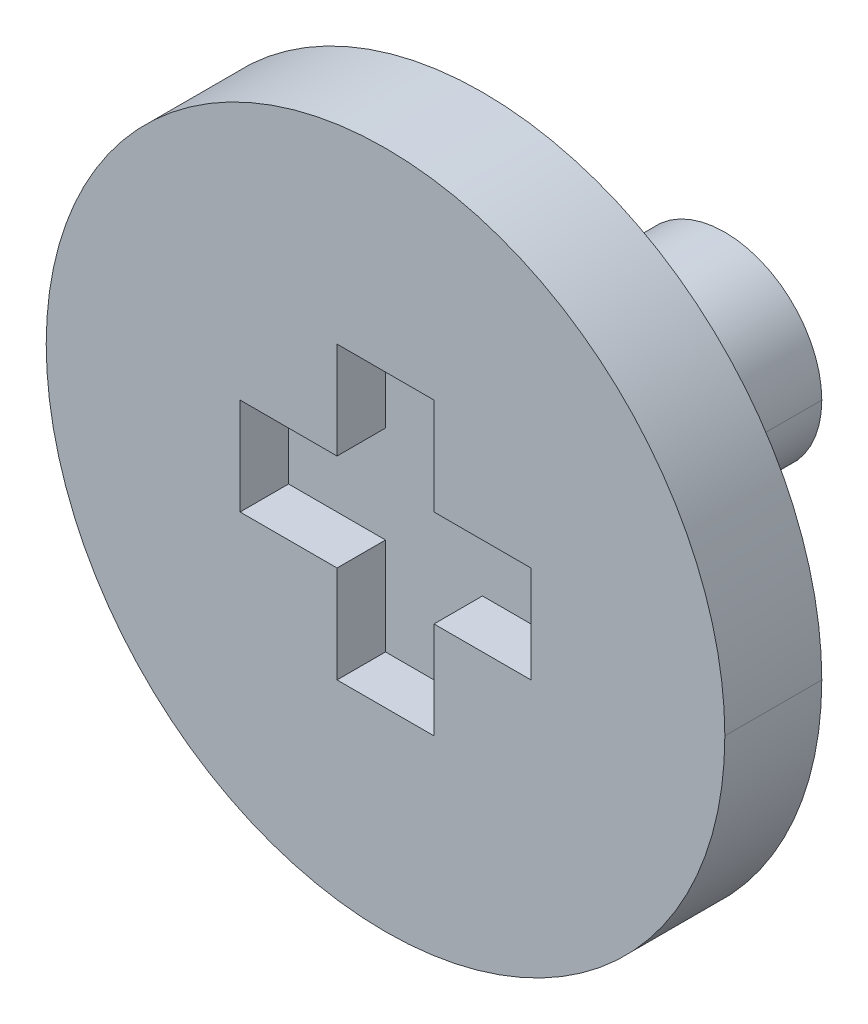
ISO-10303-21;
HEADER;
FILE_DESCRIPTION(('STEP AP214'),'2;1');
FILE_NAME('part.step','',(''),(''),'','','');
FILE_SCHEMA(('AUTOMOTIVE_DESIGN { 1 0 10303 214 1 1 1 1 }'));
ENDSEC;
DATA;
#1=APPLICATION_CONTEXT('core data for automotive mechanical design processes');
#2=APPLICATION_PROTOCOL_DEFINITION('international standard','automotive_design',2000,#1);
#3=PRODUCT_CONTEXT('',#1,'mechanical');
#4=PRODUCT('Part','Part','',(#3));
#5=PRODUCT_RELATED_PRODUCT_CATEGORY('part','',(#4));
#6=PRODUCT_DEFINITION_FORMATION('','',#4);
#7=PRODUCT_DEFINITION_CONTEXT('part definition',#1,'design');
#8=PRODUCT_DEFINITION('design','',#6,#7);
#9=PRODUCT_DEFINITION_SHAPE('','',#8);
#10=(LENGTH_UNIT() NAMED_UNIT(*) SI_UNIT(.MILLI.,.METRE.));
#11=(NAMED_UNIT(*) PLANE_ANGLE_UNIT() SI_UNIT($,.RADIAN.));
#12=(NAMED_UNIT(*) SI_UNIT($,.STERADIAN.) SOLID_ANGLE_UNIT());
#13=UNCERTAINTY_MEASURE_WITH_UNIT(LENGTH_MEASURE(1.E-05),#10,'distance_accuracy_value','');
#14=(GEOMETRIC_REPRESENTATION_CONTEXT(3) GLOBAL_UNCERTAINTY_ASSIGNED_CONTEXT((#13)) GLOBAL_UNIT_ASSIGNED_CONTEXT((#10,
#11,#12)) REPRESENTATION_CONTEXT('',''));
#15=CARTESIAN_POINT('',(0.,0.,0.));
#16=DIRECTION('',(0.,0.,1.));
#17=DIRECTION('',(1.,0.,0.));
#18=AXIS2_PLACEMENT_3D('',#15,#16,#17);
#19=CARTESIAN_POINT('',(0.,0.,0.));
#20=DIRECTION('',(0.,0.,1.));
#21=DIRECTION('',(1.,0.,0.));
#22=AXIS2_PLACEMENT_3D('',#19,#20,#21);
#23=CYLINDRICAL_SURFACE('',#22,1.);
#24=DIRECTION('',(0.,0.,1.));
#25=VECTOR('',#24,1.);
#26=CARTESIAN_POINT('',(-1.,0.,0.));
#27=LINE('',#26,#25);
#28=CARTESIAN_POINT('',(-1.,0.,0.));
#29=VERTEX_POINT('',#28);
#30=CARTESIAN_POINT('',(-1.,0.,2.5));
#31=VERTEX_POINT('',#30);
#32=EDGE_CURVE('E195',#29,#31,#27,.T.);
#33=ORIENTED_EDGE('',*,*,#32,.F.);
#34=CARTESIAN_POINT('',(0.,0.,0.));
#35=DIRECTION('',(0.,0.,1.));
#36=DIRECTION('',(-1.,0.,0.));
#37=AXIS2_PLACEMENT_3D('',#34,#35,#36);
#38=CIRCLE('',#37,1.);
#39=CARTESIAN_POINT('',(1.,0.,0.));
#40=VERTEX_POINT('',#39);
#41=EDGE_CURVE('E403',#29,#40,#38,.T.);
#42=ORIENTED_EDGE('',*,*,#41,.T.);
#43=DIRECTION('',(0.,0.,1.));
#44=VECTOR('',#43,1.);
#45=CARTESIAN_POINT('',(1.,0.,0.));
#46=LINE('',#45,#44);
#47=CARTESIAN_POINT('',(1.,0.,2.5));
#48=VERTEX_POINT('',#47);
#49=EDGE_CURVE('E407',#40,#48,#46,.T.);
#50=ORIENTED_EDGE('',*,*,#49,.T.);
#51=CARTESIAN_POINT('',(0.,0.,2.5));
#52=DIRECTION('',(0.,0.,1.));
#53=DIRECTION('',(-1.,0.,0.));
#54=AXIS2_PLACEMENT_3D('',#51,#52,#53);
#55=CIRCLE('',#54,1.);
#56=EDGE_CURVE('E184',#31,#48,#55,.T.);
#57=ORIENTED_EDGE('',*,*,#56,.F.);
#58=EDGE_LOOP('',(#33,#42,#50,#57));
#59=FACE_BOUND('',#58,.T.);
#60=ADVANCED_FACE('F17',(#59),#23,.T.);
#61=CARTESIAN_POINT('',(0.,0.,3.));
#62=DIRECTION('',(0.,0.,1.));
#63=DIRECTION('',(1.,0.,0.));
#64=AXIS2_PLACEMENT_3D('',#61,#62,#63);
#65=PLANE('',#64);
#66=DIRECTION('',(-1.,0.,0.));
#67=VECTOR('',#66,1.);
#68=CARTESIAN_POINT('',(-0.5,0.5,3.));
#69=LINE('',#68,#67);
#70=CARTESIAN_POINT('',(-0.5,0.5,3.));
#71=VERTEX_POINT('',#70);
#72=CARTESIAN_POINT('',(-1.5,0.5,3.));
#73=VERTEX_POINT('',#72);
#74=EDGE_CURVE('E11',#71,#73,#69,.T.);
#75=ORIENTED_EDGE('',*,*,#74,.T.);
#76=DIRECTION('',(0.,-1.,0.));
#77=VECTOR('',#76,1.);
#78=CARTESIAN_POINT('',(-1.5,0.5,3.));
#79=LINE('',#78,#77);
#80=CARTESIAN_POINT('',(-1.5,-0.5,3.));
#81=VERTEX_POINT('',#80);
#82=EDGE_CURVE('E43',#73,#81,#79,.T.);
#83=ORIENTED_EDGE('',*,*,#82,.T.);
#84=DIRECTION('',(1.,0.,0.));
#85=VECTOR('',#84,1.);
#86=CARTESIAN_POINT('',(-1.5,-0.5,3.));
#87=LINE('',#86,#85);
#88=CARTESIAN_POINT('',(-0.5,-0.5,3.));
#89=VERTEX_POINT('',#88);
#90=EDGE_CURVE('E290',#81,#89,#87,.T.);
#91=ORIENTED_EDGE('',*,*,#90,.T.);
#92=DIRECTION('',(0.,-1.,0.));
#93=VECTOR('',#92,1.);
#94=CARTESIAN_POINT('',(-0.5,-0.5,3.));
#95=LINE('',#94,#93);
#96=CARTESIAN_POINT('',(-0.5,-1.5,3.));
#97=VERTEX_POINT('',#96);
#98=EDGE_CURVE('E291',#89,#97,#95,.T.);
#99=ORIENTED_EDGE('',*,*,#98,.T.);
#100=DIRECTION('',(1.,0.,0.));
#101=VECTOR('',#100,1.);
#102=CARTESIAN_POINT('',(-0.5,-1.5,3.));
#103=LINE('',#102,#101);
#104=CARTESIAN_POINT('',(0.5,-1.5,3.));
#105=VERTEX_POINT('',#104);
#106=EDGE_CURVE('E316',#97,#105,#103,.T.);
#107=ORIENTED_EDGE('',*,*,#106,.T.);
#108=DIRECTION('',(0.,1.,0.));
#109=VECTOR('',#108,1.);
#110=CARTESIAN_POINT('',(0.5,-1.5,3.));
#111=LINE('',#110,#109);
#112=CARTESIAN_POINT('',(0.5,-0.5,3.));
#113=VERTEX_POINT('',#112);
#114=EDGE_CURVE('E259',#105,#113,#111,.T.);
#115=ORIENTED_EDGE('',*,*,#114,.T.);
#116=DIRECTION('',(1.,0.,0.));
#117=VECTOR('',#116,1.);
#118=CARTESIAN_POINT('',(0.5,-0.5,3.));
#119=LINE('',#118,#117);
#120=CARTESIAN_POINT('',(1.5,-0.5,3.));
#121=VERTEX_POINT('',#120);
#122=EDGE_CURVE('E260',#113,#121,#119,.T.);
#123=ORIENTED_EDGE('',*,*,#122,.T.);
#124=DIRECTION('',(0.,1.,0.));
#125=VECTOR('',#124,1.);
#126=CARTESIAN_POINT('',(1.5,-0.5,3.));
#127=LINE('',#126,#125);
#128=CARTESIAN_POINT('',(1.5,0.5,3.));
#129=VERTEX_POINT('',#128);
#130=EDGE_CURVE('E298',#121,#129,#127,.T.);
#131=ORIENTED_EDGE('',*,*,#130,.T.);
#132=DIRECTION('',(-1.,0.,0.));
#133=VECTOR('',#132,1.);
#134=CARTESIAN_POINT('',(1.5,0.5,3.));
#135=LINE('',#134,#133);
#136=CARTESIAN_POINT('',(0.5,0.5,3.));
#137=VERTEX_POINT('',#136);
#138=EDGE_CURVE('E285',#129,#137,#135,.T.);
#139=ORIENTED_EDGE('',*,*,#138,.T.);
#140=DIRECTION('',(0.,1.,0.));
#141=VECTOR('',#140,1.);
#142=CARTESIAN_POINT('',(0.5,0.5,3.));
#143=LINE('',#142,#141);
#144=CARTESIAN_POINT('',(0.5,1.5,3.));
#145=VERTEX_POINT('',#144);
#146=EDGE_CURVE('E278',#137,#145,#143,.T.);
#147=ORIENTED_EDGE('',*,*,#146,.T.);
#148=DIRECTION('',(-1.,0.,0.));
#149=VECTOR('',#148,1.);
#150=CARTESIAN_POINT('',(0.5,1.5,3.));
#151=LINE('',#150,#149);
#152=CARTESIAN_POINT('',(-0.5,1.5,3.));
#153=VERTEX_POINT('',#152);
#154=EDGE_CURVE('E210',#145,#153,#151,.T.);
#155=ORIENTED_EDGE('',*,*,#154,.T.);
#156=DIRECTION('',(0.,-1.,0.));
#157=VECTOR('',#156,1.);
#158=CARTESIAN_POINT('',(-0.5,1.5,3.));
#159=LINE('',#158,#157);
#160=EDGE_CURVE('E211',#153,#71,#159,.T.);
#161=ORIENTED_EDGE('',*,*,#160,.T.);
#162=EDGE_LOOP('',(#75,#83,#91,#99,#107,#115,#123,#131,#139,#147,#155,#161));
#163=FACE_BOUND('',#162,.T.);
#164=ADVANCED_FACE('F342',(#163),#65,.T.);
#165=CARTESIAN_POINT('',(-0.5,0.5,3.5));
#166=DIRECTION('',(0.,1.,0.));
#167=DIRECTION('',(1.,0.,0.));
#168=AXIS2_PLACEMENT_3D('',#165,#166,#167);
#169=PLANE('',#168);
#170=DIRECTION('',(0.,0.,-1.));
#171=VECTOR('',#170,1.);
#172=CARTESIAN_POINT('',(-1.5,0.5,3.5));
#173=LINE('',#172,#171);
#174=CARTESIAN_POINT('',(-1.5,0.5,3.5));
#175=VERTEX_POINT('',#174);
#176=EDGE_CURVE('E20',#175,#73,#173,.T.);
#177=ORIENTED_EDGE('',*,*,#176,.T.);
#178=ORIENTED_EDGE('',*,*,#74,.F.);
#179=DIRECTION('',(0.,0.,-1.));
#180=VECTOR('',#179,1.);
#181=CARTESIAN_POINT('',(-0.5,0.5,3.5));
#182=LINE('',#181,#180);
#183=CARTESIAN_POINT('',(-0.5,0.5,3.5));
#184=VERTEX_POINT('',#183);
#185=EDGE_CURVE('E223',#184,#71,#182,.T.);
#186=ORIENTED_EDGE('',*,*,#185,.F.);
#187=DIRECTION('',(-1.,0.,0.));
#188=VECTOR('',#187,1.);
#189=CARTESIAN_POINT('',(-0.5,0.5,3.5));
#190=LINE('',#189,#188);
#191=EDGE_CURVE('E224',#184,#175,#190,.T.);
#192=ORIENTED_EDGE('',*,*,#191,.T.);
#193=EDGE_LOOP('',(#177,#178,#186,#192));
#194=FACE_BOUND('',#193,.T.);
#195=ADVANCED_FACE('F332',(#194),#169,.F.);
#196=CARTESIAN_POINT('',(-1.5,0.5,3.5));
#197=DIRECTION('',(-1.,0.,0.));
#198=DIRECTION('',(0.,0.,1.));
#199=AXIS2_PLACEMENT_3D('',#196,#197,#198);
#200=PLANE('',#199);
#201=DIRECTION('',(0.,0.,-1.));
#202=VECTOR('',#201,1.);
#203=CARTESIAN_POINT('',(-1.5,-0.5,3.5));
#204=LINE('',#203,#202);
#205=CARTESIAN_POINT('',(-1.5,-0.5,3.5));
#206=VERTEX_POINT('',#205);
#207=EDGE_CURVE('E305',#206,#81,#204,.T.);
#208=ORIENTED_EDGE('',*,*,#207,.T.);
#209=ORIENTED_EDGE('',*,*,#82,.F.);
#210=ORIENTED_EDGE('',*,*,#176,.F.);
#211=DIRECTION('',(0.,-1.,0.));
#212=VECTOR('',#211,1.);
#213=CARTESIAN_POINT('',(-1.5,0.5,3.5));
#214=LINE('',#213,#212);
#215=EDGE_CURVE('E201',#175,#206,#214,.T.);
#216=ORIENTED_EDGE('',*,*,#215,.T.);
#217=EDGE_LOOP('',(#208,#209,#210,#216));
#218=FACE_BOUND('',#217,.T.);
#219=ADVANCED_FACE('F336',(#218),#200,.F.);
#220=CARTESIAN_POINT('',(-1.5,-0.5,3.5));
#221=DIRECTION('',(0.,-1.,0.));
#222=DIRECTION('',(0.,0.,-1.));
#223=AXIS2_PLACEMENT_3D('',#220,#221,#222);
#224=PLANE('',#223);
#225=DIRECTION('',(0.,0.,-1.));
#226=VECTOR('',#225,1.);
#227=CARTESIAN_POINT('',(-0.5,-0.5,3.5));
#228=LINE('',#227,#226);
#229=CARTESIAN_POINT('',(-0.5,-0.5,3.5));
#230=VERTEX_POINT('',#229);
#231=EDGE_CURVE('E286',#230,#89,#228,.T.);
#232=ORIENTED_EDGE('',*,*,#231,.T.);
#233=ORIENTED_EDGE('',*,*,#90,.F.);
#234=ORIENTED_EDGE('',*,*,#207,.F.);
#235=DIRECTION('',(1.,0.,0.));
#236=VECTOR('',#235,1.);
#237=CARTESIAN_POINT('',(-1.5,-0.5,3.5));
#238=LINE('',#237,#236);
#239=EDGE_CURVE('E199',#206,#230,#238,.T.);
#240=ORIENTED_EDGE('',*,*,#239,.T.);
#241=EDGE_LOOP('',(#232,#233,#234,#240));
#242=FACE_BOUND('',#241,.T.);
#243=ADVANCED_FACE('F340',(#242),#224,.F.);
#244=CARTESIAN_POINT('',(-0.5,-0.5,3.5));
#245=DIRECTION('',(-1.,0.,0.));
#246=DIRECTION('',(0.,0.,1.));
#247=AXIS2_PLACEMENT_3D('',#244,#245,#246);
#248=PLANE('',#247);
#249=DIRECTION('',(0.,0.,-1.));
#250=VECTOR('',#249,1.);
#251=CARTESIAN_POINT('',(-0.5,-1.5,3.5));
#252=LINE('',#251,#250);
#253=CARTESIAN_POINT('',(-0.5,-1.5,3.5));
#254=VERTEX_POINT('',#253);
#255=EDGE_CURVE('E319',#254,#97,#252,.T.);
#256=ORIENTED_EDGE('',*,*,#255,.T.);
#257=ORIENTED_EDGE('',*,*,#98,.F.);
#258=ORIENTED_EDGE('',*,*,#231,.F.);
#259=DIRECTION('',(0.,-1.,0.));
#260=VECTOR('',#259,1.);
#261=CARTESIAN_POINT('',(-0.5,-0.5,3.5));
#262=LINE('',#261,#260);
#263=EDGE_CURVE('E202',#230,#254,#262,.T.);
#264=ORIENTED_EDGE('',*,*,#263,.T.);
#265=EDGE_LOOP('',(#256,#257,#258,#264));
#266=FACE_BOUND('',#265,.T.);
#267=ADVANCED_FACE('F345',(#266),#248,.F.);
#268=CARTESIAN_POINT('',(-0.5,-1.5,3.5));
#269=DIRECTION('',(0.,-1.,0.));
#270=DIRECTION('',(0.,0.,-1.));
#271=AXIS2_PLACEMENT_3D('',#268,#269,#270);
#272=PLANE('',#271);
#273=DIRECTION('',(0.,0.,-1.));
#274=VECTOR('',#273,1.);
#275=CARTESIAN_POINT('',(0.5,-1.5,3.5));
#276=LINE('',#275,#274);
#277=CARTESIAN_POINT('',(0.5,-1.5,3.5));
#278=VERTEX_POINT('',#277);
#279=EDGE_CURVE('E312',#278,#105,#276,.T.);
#280=ORIENTED_EDGE('',*,*,#279,.T.);
#281=ORIENTED_EDGE('',*,*,#106,.F.);
#282=ORIENTED_EDGE('',*,*,#255,.F.);
#283=DIRECTION('',(1.,0.,0.));
#284=VECTOR('',#283,1.);
#285=CARTESIAN_POINT('',(-0.5,-1.5,3.5));
#286=LINE('',#285,#284);
#287=EDGE_CURVE('E242',#254,#278,#286,.T.);
#288=ORIENTED_EDGE('',*,*,#287,.T.);
#289=EDGE_LOOP('',(#280,#281,#282,#288));
#290=FACE_BOUND('',#289,.T.);
#291=ADVANCED_FACE('F349',(#290),#272,.F.);
#292=CARTESIAN_POINT('',(0.5,-1.5,3.5));
#293=DIRECTION('',(1.,0.,0.));
#294=DIRECTION('',(0.,1.,0.));
#295=AXIS2_PLACEMENT_3D('',#292,#293,#294);
#296=PLANE('',#295);
#297=DIRECTION('',(0.,0.,-1.));
#298=VECTOR('',#297,1.);
#299=CARTESIAN_POINT('',(0.5,-0.5,3.5));
#300=LINE('',#299,#298);
#301=CARTESIAN_POINT('',(0.5,-0.5,3.5));
#302=VERTEX_POINT('',#301);
#303=EDGE_CURVE('E255',#302,#113,#300,.T.);
#304=ORIENTED_EDGE('',*,*,#303,.T.);
#305=ORIENTED_EDGE('',*,*,#114,.F.);
#306=ORIENTED_EDGE('',*,*,#279,.F.);
#307=DIRECTION('',(0.,1.,0.));
#308=VECTOR('',#307,1.);
#309=CARTESIAN_POINT('',(0.5,-1.5,3.5));
#310=LINE('',#309,#308);
#311=EDGE_CURVE('E238',#278,#302,#310,.T.);
#312=ORIENTED_EDGE('',*,*,#311,.T.);
#313=EDGE_LOOP('',(#304,#305,#306,#312));
#314=FACE_BOUND('',#313,.T.);
#315=ADVANCED_FACE('F353',(#314),#296,.F.);
#316=CARTESIAN_POINT('',(0.5,-0.5,3.5));
#317=DIRECTION('',(0.,-1.,0.));
#318=DIRECTION('',(0.,0.,-1.));
#319=AXIS2_PLACEMENT_3D('',#316,#317,#318);
#320=PLANE('',#319);
#321=DIRECTION('',(0.,0.,-1.));
#322=VECTOR('',#321,1.);
#323=CARTESIAN_POINT('',(1.5,-0.5,3.5));
#324=LINE('',#323,#322);
#325=CARTESIAN_POINT('',(1.5,-0.5,3.5));
#326=VERTEX_POINT('',#325);
#327=EDGE_CURVE('E301',#326,#121,#324,.T.);
#328=ORIENTED_EDGE('',*,*,#327,.T.);
#329=ORIENTED_EDGE('',*,*,#122,.F.);
#330=ORIENTED_EDGE('',*,*,#303,.F.);
#331=DIRECTION('',(1.,0.,0.));
#332=VECTOR('',#331,1.);
#333=CARTESIAN_POINT('',(0.5,-0.5,3.5));
#334=LINE('',#333,#332);
#335=EDGE_CURVE('E228',#302,#326,#334,.T.);
#336=ORIENTED_EDGE('',*,*,#335,.T.);
#337=EDGE_LOOP('',(#328,#329,#330,#336));
#338=FACE_BOUND('',#337,.T.);
#339=ADVANCED_FACE('F357',(#338),#320,.F.);
#340=CARTESIAN_POINT('',(1.5,-0.5,3.5));
#341=DIRECTION('',(1.,0.,0.));
#342=DIRECTION('',(0.,1.,0.));
#343=AXIS2_PLACEMENT_3D('',#340,#341,#342);
#344=PLANE('',#343);
#345=DIRECTION('',(0.,0.,-1.));
#346=VECTOR('',#345,1.);
#347=CARTESIAN_POINT('',(1.5,0.5,3.5));
#348=LINE('',#347,#346);
#349=CARTESIAN_POINT('',(1.5,0.5,3.5));
#350=VERTEX_POINT('',#349);
#351=EDGE_CURVE('E294',#350,#129,#348,.T.);
#352=ORIENTED_EDGE('',*,*,#351,.T.);
#353=ORIENTED_EDGE('',*,*,#130,.F.);
#354=ORIENTED_EDGE('',*,*,#327,.F.);
#355=DIRECTION('',(0.,1.,0.));
#356=VECTOR('',#355,1.);
#357=CARTESIAN_POINT('',(1.5,-0.5,3.5));
#358=LINE('',#357,#356);
#359=EDGE_CURVE('E225',#326,#350,#358,.T.);
#360=ORIENTED_EDGE('',*,*,#359,.T.);
#361=EDGE_LOOP('',(#352,#353,#354,#360));
#362=FACE_BOUND('',#361,.T.);
#363=ADVANCED_FACE('F361',(#362),#344,.F.);
#364=CARTESIAN_POINT('',(1.5,0.5,3.5));
#365=DIRECTION('',(0.,1.,0.));
#366=DIRECTION('',(1.,0.,0.));
#367=AXIS2_PLACEMENT_3D('',#364,#365,#366);
#368=PLANE('',#367);
#369=DIRECTION('',(0.,0.,-1.));
#370=VECTOR('',#369,1.);
#371=CARTESIAN_POINT('',(0.5,0.5,3.5));
#372=LINE('',#371,#370);
#373=CARTESIAN_POINT('',(0.5,0.5,3.5));
#374=VERTEX_POINT('',#373);
#375=EDGE_CURVE('E281',#374,#137,#372,.T.);
#376=ORIENTED_EDGE('',*,*,#375,.T.);
#377=ORIENTED_EDGE('',*,*,#138,.F.);
#378=ORIENTED_EDGE('',*,*,#351,.F.);
#379=DIRECTION('',(-1.,0.,0.));
#380=VECTOR('',#379,1.);
#381=CARTESIAN_POINT('',(1.5,0.5,3.5));
#382=LINE('',#381,#380);
#383=EDGE_CURVE('E229',#350,#374,#382,.T.);
#384=ORIENTED_EDGE('',*,*,#383,.T.);
#385=EDGE_LOOP('',(#376,#377,#378,#384));
#386=FACE_BOUND('',#385,.T.);
#387=ADVANCED_FACE('F365',(#386),#368,.F.);
#388=CARTESIAN_POINT('',(0.5,0.5,3.5));
#389=DIRECTION('',(1.,0.,0.));
#390=DIRECTION('',(0.,1.,0.));
#391=AXIS2_PLACEMENT_3D('',#388,#389,#390);
#392=PLANE('',#391);
#393=DIRECTION('',(0.,0.,-1.));
#394=VECTOR('',#393,1.);
#395=CARTESIAN_POINT('',(0.5,1.5,3.5));
#396=LINE('',#395,#394);
#397=CARTESIAN_POINT('',(0.5,1.5,3.5));
#398=VERTEX_POINT('',#397);
#399=EDGE_CURVE('E263',#398,#145,#396,.T.);
#400=ORIENTED_EDGE('',*,*,#399,.T.);
#401=ORIENTED_EDGE('',*,*,#146,.F.);
#402=ORIENTED_EDGE('',*,*,#375,.F.);
#403=DIRECTION('',(0.,1.,0.));
#404=VECTOR('',#403,1.);
#405=CARTESIAN_POINT('',(0.5,0.5,3.5));
#406=LINE('',#405,#404);
#407=EDGE_CURVE('E234',#374,#398,#406,.T.);
#408=ORIENTED_EDGE('',*,*,#407,.T.);
#409=EDGE_LOOP('',(#400,#401,#402,#408));
#410=FACE_BOUND('',#409,.T.);
#411=ADVANCED_FACE('F369',(#410),#392,.F.);
#412=CARTESIAN_POINT('',(0.5,1.5,3.5));
#413=DIRECTION('',(0.,1.,0.));
#414=DIRECTION('',(1.,0.,0.));
#415=AXIS2_PLACEMENT_3D('',#412,#413,#414);
#416=PLANE('',#415);
#417=DIRECTION('',(0.,0.,-1.));
#418=VECTOR('',#417,1.);
#419=CARTESIAN_POINT('',(-0.5,1.5,3.5));
#420=LINE('',#419,#418);
#421=CARTESIAN_POINT('',(-0.5,1.5,3.5));
#422=VERTEX_POINT('',#421);
#423=EDGE_CURVE('E206',#422,#153,#420,.T.);
#424=ORIENTED_EDGE('',*,*,#423,.T.);
#425=ORIENTED_EDGE('',*,*,#154,.F.);
#426=ORIENTED_EDGE('',*,*,#399,.F.);
#427=DIRECTION('',(-1.,0.,0.));
#428=VECTOR('',#427,1.);
#429=CARTESIAN_POINT('',(0.5,1.5,3.5));
#430=LINE('',#429,#428);
#431=EDGE_CURVE('E216',#398,#422,#430,.T.);
#432=ORIENTED_EDGE('',*,*,#431,.T.);
#433=EDGE_LOOP('',(#424,#425,#426,#432));
#434=FACE_BOUND('',#433,.T.);
#435=ADVANCED_FACE('F373',(#434),#416,.F.);
#436=CARTESIAN_POINT('',(-0.5,1.5,3.5));
#437=DIRECTION('',(-1.,0.,0.));
#438=DIRECTION('',(0.,0.,1.));
#439=AXIS2_PLACEMENT_3D('',#436,#437,#438);
#440=PLANE('',#439);
#441=ORIENTED_EDGE('',*,*,#185,.T.);
#442=ORIENTED_EDGE('',*,*,#160,.F.);
#443=ORIENTED_EDGE('',*,*,#423,.F.);
#444=DIRECTION('',(0.,-1.,0.));
#445=VECTOR('',#444,1.);
#446=CARTESIAN_POINT('',(-0.5,1.5,3.5));
#447=LINE('',#446,#445);
#448=EDGE_CURVE('E219',#422,#184,#447,.T.);
#449=ORIENTED_EDGE('',*,*,#448,.T.);
#450=EDGE_LOOP('',(#441,#442,#443,#449));
#451=FACE_BOUND('',#450,.T.);
#452=ADVANCED_FACE('F377',(#451),#440,.F.);
#453=CARTESIAN_POINT('',(0.,0.,3.5));
#454=DIRECTION('',(0.,0.,1.));
#455=DIRECTION('',(1.,0.,0.));
#456=AXIS2_PLACEMENT_3D('',#453,#454,#455);
#457=PLANE('',#456);
#458=ORIENTED_EDGE('',*,*,#431,.F.);
#459=ORIENTED_EDGE('',*,*,#407,.F.);
#460=ORIENTED_EDGE('',*,*,#383,.F.);
#461=ORIENTED_EDGE('',*,*,#359,.F.);
#462=ORIENTED_EDGE('',*,*,#335,.F.);
#463=ORIENTED_EDGE('',*,*,#311,.F.);
#464=ORIENTED_EDGE('',*,*,#287,.F.);
#465=ORIENTED_EDGE('',*,*,#263,.F.);
#466=ORIENTED_EDGE('',*,*,#239,.F.);
#467=ORIENTED_EDGE('',*,*,#215,.F.);
#468=ORIENTED_EDGE('',*,*,#191,.F.);
#469=ORIENTED_EDGE('',*,*,#448,.F.);
#470=EDGE_LOOP('',(#458,#459,#460,#461,#462,#463,#464,#465,#466,#467,#468,#469));
#471=FACE_BOUND('',#470,.T.);
#472=CARTESIAN_POINT('',(0.,0.,3.5));
#473=DIRECTION('',(0.,0.,1.));
#474=DIRECTION('',(-1.,0.,0.));
#475=AXIS2_PLACEMENT_3D('',#472,#473,#474);
#476=CIRCLE('',#475,3.5);
#477=CARTESIAN_POINT('',(-3.5,0.,3.5));
#478=VERTEX_POINT('',#477);
#479=CARTESIAN_POINT('',(3.5,0.,3.5));
#480=VERTEX_POINT('',#479);
#481=EDGE_CURVE('E178',#478,#480,#476,.T.);
#482=ORIENTED_EDGE('',*,*,#481,.T.);
#483=CARTESIAN_POINT('',(0.,0.,3.5));
#484=DIRECTION('',(0.,0.,1.));
#485=DIRECTION('',(1.,0.,0.));
#486=AXIS2_PLACEMENT_3D('',#483,#484,#485);
#487=CIRCLE('',#486,3.5);
#488=EDGE_CURVE('E174',#480,#478,#487,.T.);
#489=ORIENTED_EDGE('',*,*,#488,.T.);
#490=EDGE_LOOP('',(#482,#489));
#491=FACE_BOUND('',#490,.T.);
#492=ADVANCED_FACE('F379',(#471,#491),#457,.T.);
#493=CARTESIAN_POINT('',(0.,0.,2.5));
#494=DIRECTION('',(0.,0.,1.));
#495=DIRECTION('',(1.,0.,0.));
#496=AXIS2_PLACEMENT_3D('',#493,#494,#495);
#497=CYLINDRICAL_SURFACE('',#496,3.5);
#498=DIRECTION('',(0.,0.,1.));
#499=VECTOR('',#498,1.);
#500=CARTESIAN_POINT('',(3.5,0.,2.5));
#501=LINE('',#500,#499);
#502=CARTESIAN_POINT('',(3.5,0.,2.5));
#503=VERTEX_POINT('',#502);
#504=EDGE_CURVE('E167',#503,#480,#501,.T.);
#505=ORIENTED_EDGE('',*,*,#504,.T.);
#506=ORIENTED_EDGE('',*,*,#481,.F.);
#507=DIRECTION('',(0.,0.,1.));
#508=VECTOR('',#507,1.);
#509=CARTESIAN_POINT('',(-3.5,0.,2.5));
#510=LINE('',#509,#508);
#511=CARTESIAN_POINT('',(-3.5,0.,2.5));
#512=VERTEX_POINT('',#511);
#513=EDGE_CURVE('E187',#512,#478,#510,.T.);
#514=ORIENTED_EDGE('',*,*,#513,.F.);
#515=CARTESIAN_POINT('',(0.,0.,2.5));
#516=DIRECTION('',(0.,0.,1.));
#517=DIRECTION('',(-1.,0.,0.));
#518=AXIS2_PLACEMENT_3D('',#515,#516,#517);
#519=CIRCLE('',#518,3.5);
#520=EDGE_CURVE('E182',#512,#503,#519,.T.);
#521=ORIENTED_EDGE('',*,*,#520,.T.);
#522=EDGE_LOOP('',(#505,#506,#514,#521));
#523=FACE_BOUND('',#522,.T.);
#524=ADVANCED_FACE('F186',(#523),#497,.T.);
#525=CARTESIAN_POINT('',(0.,0.,2.5));
#526=DIRECTION('',(0.,0.,1.));
#527=DIRECTION('',(1.,0.,0.));
#528=AXIS2_PLACEMENT_3D('',#525,#526,#527);
#529=CYLINDRICAL_SURFACE('',#528,3.5);
#530=ORIENTED_EDGE('',*,*,#513,.T.);
#531=ORIENTED_EDGE('',*,*,#488,.F.);
#532=ORIENTED_EDGE('',*,*,#504,.F.);
#533=CARTESIAN_POINT('',(0.,0.,2.5));
#534=DIRECTION('',(0.,0.,1.));
#535=DIRECTION('',(1.,0.,0.));
#536=AXIS2_PLACEMENT_3D('',#533,#534,#535);
#537=CIRCLE('',#536,3.5);
#538=EDGE_CURVE('E171',#503,#512,#537,.T.);
#539=ORIENTED_EDGE('',*,*,#538,.T.);
#540=EDGE_LOOP('',(#530,#531,#532,#539));
#541=FACE_BOUND('',#540,.T.);
#542=ADVANCED_FACE('F170',(#541),#529,.T.);
#543=CARTESIAN_POINT('',(0.,0.,2.5));
#544=DIRECTION('',(0.,0.,1.));
#545=DIRECTION('',(1.,0.,0.));
#546=AXIS2_PLACEMENT_3D('',#543,#544,#545);
#547=PLANE('',#546);
#548=ORIENTED_EDGE('',*,*,#56,.T.);
#549=CARTESIAN_POINT('',(0.,0.,2.5));
#550=DIRECTION('',(0.,0.,1.));
#551=DIRECTION('',(1.,0.,0.));
#552=AXIS2_PLACEMENT_3D('',#549,#550,#551);
#553=CIRCLE('',#552,1.);
#554=EDGE_CURVE('E189',#48,#31,#553,.T.);
#555=ORIENTED_EDGE('',*,*,#554,.T.);
#556=EDGE_LOOP('',(#548,#555));
#557=FACE_BOUND('',#556,.T.);
#558=ORIENTED_EDGE('',*,*,#520,.F.);
#559=ORIENTED_EDGE('',*,*,#538,.F.);
#560=EDGE_LOOP('',(#558,#559));
#561=FACE_BOUND('',#560,.T.);
#562=ADVANCED_FACE('F181',(#557,#561),#547,.F.);
#563=CARTESIAN_POINT('',(0.,0.,0.));
#564=DIRECTION('',(0.,0.,1.));
#565=DIRECTION('',(1.,0.,0.));
#566=AXIS2_PLACEMENT_3D('',#563,#564,#565);
#567=CYLINDRICAL_SURFACE('',#566,1.);
#568=ORIENTED_EDGE('',*,*,#49,.F.);
#569=CARTESIAN_POINT('',(0.,0.,0.));
#570=DIRECTION('',(0.,0.,1.));
#571=DIRECTION('',(1.,0.,0.));
#572=AXIS2_PLACEMENT_3D('',#569,#570,#571);
#573=CIRCLE('',#572,1.);
#574=EDGE_CURVE('E409',#40,#29,#573,.T.);
#575=ORIENTED_EDGE('',*,*,#574,.T.);
#576=ORIENTED_EDGE('',*,*,#32,.T.);
#577=ORIENTED_EDGE('',*,*,#554,.F.);
#578=EDGE_LOOP('',(#568,#575,#576,#577));
#579=FACE_BOUND('',#578,.T.);
#580=ADVANCED_FACE('F410',(#579),#567,.T.);
#581=CARTESIAN_POINT('',(0.,0.,0.));
#582=DIRECTION('',(0.,0.,1.));
#583=DIRECTION('',(1.,0.,0.));
#584=AXIS2_PLACEMENT_3D('',#581,#582,#583);
#585=PLANE('',#584);
#586=ORIENTED_EDGE('',*,*,#41,.F.);
#587=ORIENTED_EDGE('',*,*,#574,.F.);
#588=EDGE_LOOP('',(#586,#587));
#589=FACE_BOUND('',#588,.T.);
#590=ADVANCED_FACE('F414',(#589),#585,.F.);
#591=CLOSED_SHELL('',(#60,#164,#195,#219,#243,#267,#291,#315,#339,#363,#387,#411,#435,#452,#492,
#524,#542,#562,#580,#590));
#592=MANIFOLD_SOLID_BREP('B1',#591);
#593=ADVANCED_BREP_SHAPE_REPRESENTATION('',(#18,#592),#14);
#594=SHAPE_DEFINITION_REPRESENTATION(#9,#593);
ENDSEC;
END-ISO-10303-21;
